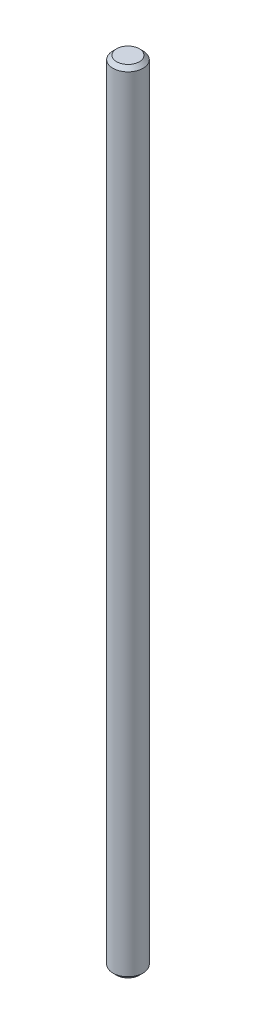
ISO-10303-21;
HEADER;
FILE_DESCRIPTION(('STEP AP214'),'2;1');
FILE_NAME('part.step','',(''),(''),'','','');
FILE_SCHEMA(('AUTOMOTIVE_DESIGN { 1 0 10303 214 1 1 1 1 }'));
ENDSEC;
DATA;
#1=APPLICATION_CONTEXT('core data for automotive mechanical design processes');
#2=APPLICATION_PROTOCOL_DEFINITION('international standard','automotive_design',2000,#1);
#3=PRODUCT_CONTEXT('',#1,'mechanical');
#4=PRODUCT('Part','Part','',(#3));
#5=PRODUCT_RELATED_PRODUCT_CATEGORY('part','',(#4));
#6=PRODUCT_DEFINITION_FORMATION('','',#4);
#7=PRODUCT_DEFINITION_CONTEXT('part definition',#1,'design');
#8=PRODUCT_DEFINITION('design','',#6,#7);
#9=PRODUCT_DEFINITION_SHAPE('','',#8);
#10=(LENGTH_UNIT() NAMED_UNIT(*) SI_UNIT(.MILLI.,.METRE.));
#11=(NAMED_UNIT(*) PLANE_ANGLE_UNIT() SI_UNIT($,.RADIAN.));
#12=(NAMED_UNIT(*) SI_UNIT($,.STERADIAN.) SOLID_ANGLE_UNIT());
#13=UNCERTAINTY_MEASURE_WITH_UNIT(LENGTH_MEASURE(1.E-05),#10,'distance_accuracy_value','');
#14=(GEOMETRIC_REPRESENTATION_CONTEXT(3) GLOBAL_UNCERTAINTY_ASSIGNED_CONTEXT((#13)) GLOBAL_UNIT_ASSIGNED_CONTEXT((#10,
#11,#12)) REPRESENTATION_CONTEXT('',''));
#15=CARTESIAN_POINT('',(0.,0.,0.));
#16=DIRECTION('',(0.,0.,1.));
#17=DIRECTION('',(1.,0.,0.));
#18=AXIS2_PLACEMENT_3D('',#15,#16,#17);
#19=CARTESIAN_POINT('',(0.,52.5,0.));
#20=DIRECTION('',(0.,-1.,0.));
#21=DIRECTION('',(0.,0.,-1.));
#22=AXIS2_PLACEMENT_3D('',#19,#20,#21);
#23=CYLINDRICAL_SURFACE('',#22,2.);
#24=CARTESIAN_POINT('',(0.,52.,0.));
#25=DIRECTION('',(0.,1.,0.));
#26=DIRECTION('',(0.,0.,1.));
#27=AXIS2_PLACEMENT_3D('',#24,#25,#26);
#28=CIRCLE('',#27,2.);
#29=CARTESIAN_POINT('',(0.,52.,2.));
#30=VERTEX_POINT('',#29);
#31=EDGE_CURVE('E57',#30,#30,#28,.F.);
#32=ORIENTED_EDGE('',*,*,#31,.T.);
#33=EDGE_LOOP('',(#32));
#34=FACE_BOUND('',#33,.T.);
#35=CARTESIAN_POINT('',(0.,-52.,0.));
#36=DIRECTION('',(0.,1.,0.));
#37=DIRECTION('',(0.,0.,1.));
#38=AXIS2_PLACEMENT_3D('',#35,#36,#37);
#39=CIRCLE('',#38,2.);
#40=CARTESIAN_POINT('',(0.,-52.,2.));
#41=VERTEX_POINT('',#40);
#42=EDGE_CURVE('E62',#41,#41,#39,.T.);
#43=ORIENTED_EDGE('',*,*,#42,.T.);
#44=EDGE_LOOP('',(#43));
#45=FACE_BOUND('',#44,.T.);
#46=ADVANCED_FACE('F48',(#34,#45),#23,.T.);
#47=CARTESIAN_POINT('',(0.,52.5,0.));
#48=DIRECTION('',(0.,1.,0.));
#49=DIRECTION('',(0.,0.,1.));
#50=AXIS2_PLACEMENT_3D('',#47,#48,#49);
#51=PLANE('',#50);
#52=CARTESIAN_POINT('',(0.,52.5,0.));
#53=DIRECTION('',(0.,1.,0.));
#54=DIRECTION('',(0.,0.,1.));
#55=AXIS2_PLACEMENT_3D('',#52,#53,#54);
#56=CIRCLE('',#55,1.5);
#57=CARTESIAN_POINT('',(0.,52.5,1.5));
#58=VERTEX_POINT('',#57);
#59=EDGE_CURVE('E67',#58,#58,#56,.T.);
#60=ORIENTED_EDGE('',*,*,#59,.T.);
#61=EDGE_LOOP('',(#60));
#62=FACE_BOUND('',#61,.T.);
#63=ADVANCED_FACE('F74',(#62),#51,.T.);
#64=CARTESIAN_POINT('',(0.,-52.5,0.));
#65=DIRECTION('',(0.,1.,0.));
#66=DIRECTION('',(0.,0.,1.));
#67=AXIS2_PLACEMENT_3D('',#64,#65,#66);
#68=PLANE('',#67);
#69=CARTESIAN_POINT('',(0.,-52.5,0.));
#70=DIRECTION('',(0.,1.,0.));
#71=DIRECTION('',(0.,0.,1.));
#72=AXIS2_PLACEMENT_3D('',#69,#70,#71);
#73=CIRCLE('',#72,1.5);
#74=CARTESIAN_POINT('',(0.,-52.5,1.5));
#75=VERTEX_POINT('',#74);
#76=EDGE_CURVE('E10',#75,#75,#73,.F.);
#77=ORIENTED_EDGE('',*,*,#76,.T.);
#78=EDGE_LOOP('',(#77));
#79=FACE_BOUND('',#78,.T.);
#80=ADVANCED_FACE('F78',(#79),#68,.F.);
#81=CARTESIAN_POINT('',(0.,52.5,0.));
#82=DIRECTION('',(0.,-1.,0.));
#83=DIRECTION('',(0.,0.,-1.));
#84=AXIS2_PLACEMENT_3D('',#81,#82,#83);
#85=CONICAL_SURFACE('',#84,1.5,0.785398163397453);
#86=ORIENTED_EDGE('',*,*,#31,.F.);
#87=EDGE_LOOP('',(#86));
#88=FACE_BOUND('',#87,.T.);
#89=ORIENTED_EDGE('',*,*,#59,.F.);
#90=EDGE_LOOP('',(#89));
#91=FACE_BOUND('',#90,.T.);
#92=ADVANCED_FACE('F76',(#88,#91),#85,.T.);
#93=CARTESIAN_POINT('',(0.,-52.,0.));
#94=DIRECTION('',(0.,1.,0.));
#95=DIRECTION('',(0.,0.,1.));
#96=AXIS2_PLACEMENT_3D('',#93,#94,#95);
#97=CONICAL_SURFACE('',#96,2.,0.785398163397433);
#98=ORIENTED_EDGE('',*,*,#76,.F.);
#99=EDGE_LOOP('',(#98));
#100=FACE_BOUND('',#99,.T.);
#101=ORIENTED_EDGE('',*,*,#42,.F.);
#102=EDGE_LOOP('',(#101));
#103=FACE_BOUND('',#102,.T.);
#104=ADVANCED_FACE('F51',(#100,#103),#97,.T.);
#105=CLOSED_SHELL('',(#46,#63,#80,#92,#104));
#106=MANIFOLD_SOLID_BREP('B2',#105);
#107=ADVANCED_BREP_SHAPE_REPRESENTATION('',(#18,#106),#14);
#108=SHAPE_DEFINITION_REPRESENTATION(#9,#107);
ENDSEC;
END-ISO-10303-21;
